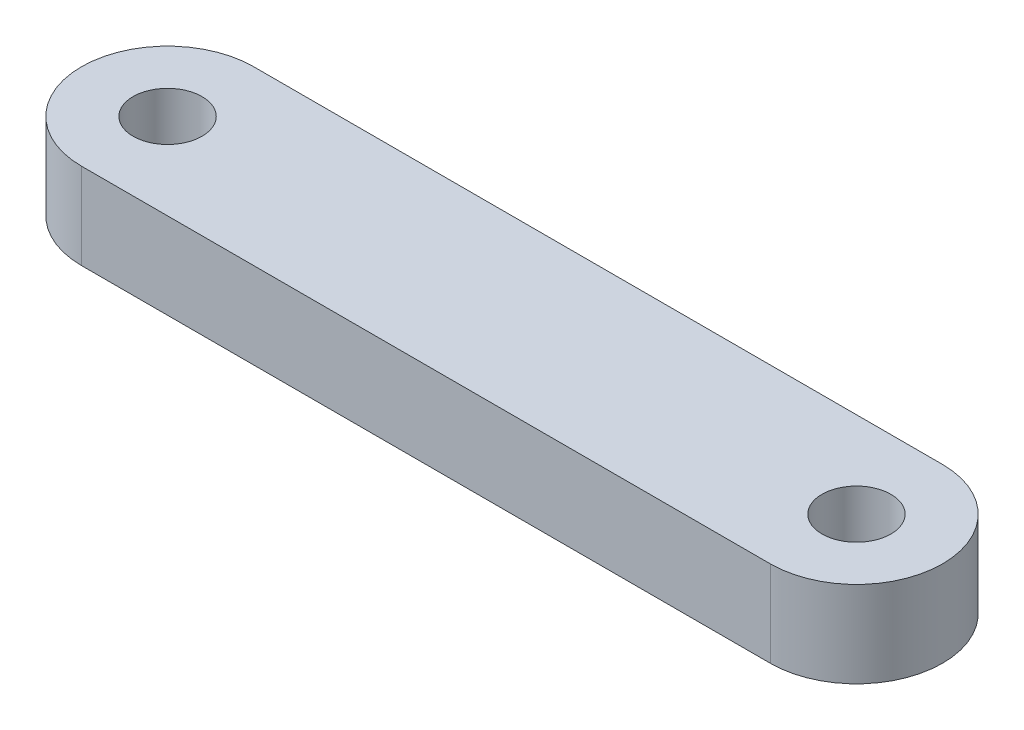
ISO-10303-21;
HEADER;
FILE_DESCRIPTION(('STEP AP214'),'2;1');
FILE_NAME('part.step','',(''),(''),'','','');
FILE_SCHEMA(('AUTOMOTIVE_DESIGN { 1 0 10303 214 1 1 1 1 }'));
ENDSEC;
DATA;
#1=APPLICATION_CONTEXT('core data for automotive mechanical design processes');
#2=APPLICATION_PROTOCOL_DEFINITION('international standard','automotive_design',2000,#1);
#3=PRODUCT_CONTEXT('',#1,'mechanical');
#4=PRODUCT('Part','Part','',(#3));
#5=PRODUCT_RELATED_PRODUCT_CATEGORY('part','',(#4));
#6=PRODUCT_DEFINITION_FORMATION('','',#4);
#7=PRODUCT_DEFINITION_CONTEXT('part definition',#1,'design');
#8=PRODUCT_DEFINITION('design','',#6,#7);
#9=PRODUCT_DEFINITION_SHAPE('','',#8);
#10=(LENGTH_UNIT() NAMED_UNIT(*) SI_UNIT(.MILLI.,.METRE.));
#11=(NAMED_UNIT(*) PLANE_ANGLE_UNIT() SI_UNIT($,.RADIAN.));
#12=(NAMED_UNIT(*) SI_UNIT($,.STERADIAN.) SOLID_ANGLE_UNIT());
#13=UNCERTAINTY_MEASURE_WITH_UNIT(LENGTH_MEASURE(1.E-05),#10,'distance_accuracy_value','');
#14=(GEOMETRIC_REPRESENTATION_CONTEXT(3) GLOBAL_UNCERTAINTY_ASSIGNED_CONTEXT((#13)) GLOBAL_UNIT_ASSIGNED_CONTEXT((#10,
#11,#12)) REPRESENTATION_CONTEXT('',''));
#15=CARTESIAN_POINT('',(0.,0.,0.));
#16=DIRECTION('',(0.,0.,1.));
#17=DIRECTION('',(1.,0.,0.));
#18=AXIS2_PLACEMENT_3D('',#15,#16,#17);
#19=CARTESIAN_POINT('',(-58.5992733205223,50.,0.));
#20=DIRECTION('',(0.,-1.,0.));
#21=DIRECTION('',(0.,0.,-1.));
#22=AXIS2_PLACEMENT_3D('',#19,#20,#21);
#23=CYLINDRICAL_SURFACE('',#22,50.);
#24=CARTESIAN_POINT('',(-58.5992733205223,0.,0.));
#25=DIRECTION('',(0.,1.,0.));
#26=DIRECTION('',(0.,0.,1.));
#27=AXIS2_PLACEMENT_3D('',#24,#25,#26);
#28=CIRCLE('',#27,50.);
#29=CARTESIAN_POINT('',(-58.5992733205223,0.,-50.));
#30=VERTEX_POINT('',#29);
#31=CARTESIAN_POINT('',(-58.5992733205223,0.,50.));
#32=VERTEX_POINT('',#31);
#33=EDGE_CURVE('E96',#30,#32,#28,.T.);
#34=ORIENTED_EDGE('',*,*,#33,.T.);
#35=DIRECTION('',(0.,-1.,0.));
#36=VECTOR('',#35,1.);
#37=CARTESIAN_POINT('',(-58.5992733205223,50.,50.));
#38=LINE('',#37,#36);
#39=CARTESIAN_POINT('',(-58.5992733205223,50.,50.));
#40=VERTEX_POINT('',#39);
#41=EDGE_CURVE('E11',#40,#32,#38,.T.);
#42=ORIENTED_EDGE('',*,*,#41,.F.);
#43=CARTESIAN_POINT('',(-58.5992733205223,50.,0.));
#44=DIRECTION('',(0.,1.,0.));
#45=DIRECTION('',(0.,0.,1.));
#46=AXIS2_PLACEMENT_3D('',#43,#44,#45);
#47=CIRCLE('',#46,50.);
#48=CARTESIAN_POINT('',(-58.5992733205223,50.,-50.));
#49=VERTEX_POINT('',#48);
#50=EDGE_CURVE('E84',#49,#40,#47,.T.);
#51=ORIENTED_EDGE('',*,*,#50,.F.);
#52=DIRECTION('',(0.,-1.,0.));
#53=VECTOR('',#52,1.);
#54=CARTESIAN_POINT('',(-58.5992733205223,50.,-50.));
#55=LINE('',#54,#53);
#56=EDGE_CURVE('E92',#49,#30,#55,.T.);
#57=ORIENTED_EDGE('',*,*,#56,.T.);
#58=EDGE_LOOP('',(#34,#42,#51,#57));
#59=FACE_BOUND('',#58,.T.);
#60=ADVANCED_FACE('F33',(#59),#23,.T.);
#61=CARTESIAN_POINT('',(-58.5992733205223,50.,50.));
#62=DIRECTION('',(0.,0.,-1.));
#63=DIRECTION('',(-1.,0.,0.));
#64=AXIS2_PLACEMENT_3D('',#61,#62,#63);
#65=PLANE('',#64);
#66=DIRECTION('',(1.,0.,0.));
#67=VECTOR('',#66,1.);
#68=CARTESIAN_POINT('',(-58.5992733205223,0.,50.));
#69=LINE('',#68,#67);
#70=CARTESIAN_POINT('',(341.400726679478,0.,50.));
#71=VERTEX_POINT('',#70);
#72=EDGE_CURVE('E88',#32,#71,#69,.T.);
#73=ORIENTED_EDGE('',*,*,#72,.T.);
#74=DIRECTION('',(0.,-1.,0.));
#75=VECTOR('',#74,1.);
#76=CARTESIAN_POINT('',(341.400726679478,50.,50.));
#77=LINE('',#76,#75);
#78=CARTESIAN_POINT('',(341.400726679478,50.,50.));
#79=VERTEX_POINT('',#78);
#80=EDGE_CURVE('E41',#79,#71,#77,.T.);
#81=ORIENTED_EDGE('',*,*,#80,.F.);
#82=DIRECTION('',(1.,0.,0.));
#83=VECTOR('',#82,1.);
#84=CARTESIAN_POINT('',(-58.5992733205223,50.,50.));
#85=LINE('',#84,#83);
#86=EDGE_CURVE('E79',#40,#79,#85,.T.);
#87=ORIENTED_EDGE('',*,*,#86,.F.);
#88=ORIENTED_EDGE('',*,*,#41,.T.);
#89=EDGE_LOOP('',(#73,#81,#87,#88));
#90=FACE_BOUND('',#89,.T.);
#91=ADVANCED_FACE('F87',(#90),#65,.F.);
#92=CARTESIAN_POINT('',(341.400726679478,50.,0.));
#93=DIRECTION('',(0.,-1.,0.));
#94=DIRECTION('',(0.,0.,-1.));
#95=AXIS2_PLACEMENT_3D('',#92,#93,#94);
#96=CYLINDRICAL_SURFACE('',#95,50.);
#97=CARTESIAN_POINT('',(341.400726679478,0.,0.));
#98=DIRECTION('',(0.,1.,0.));
#99=DIRECTION('',(0.,0.,1.));
#100=AXIS2_PLACEMENT_3D('',#97,#98,#99);
#101=CIRCLE('',#100,50.);
#102=CARTESIAN_POINT('',(341.400726679478,0.,-50.));
#103=VERTEX_POINT('',#102);
#104=EDGE_CURVE('E66',#71,#103,#101,.T.);
#105=ORIENTED_EDGE('',*,*,#104,.T.);
#106=DIRECTION('',(0.,-1.,0.));
#107=VECTOR('',#106,1.);
#108=CARTESIAN_POINT('',(341.400726679478,50.,-50.));
#109=LINE('',#108,#107);
#110=CARTESIAN_POINT('',(341.400726679478,50.,-50.));
#111=VERTEX_POINT('',#110);
#112=EDGE_CURVE('E89',#111,#103,#109,.T.);
#113=ORIENTED_EDGE('',*,*,#112,.F.);
#114=CARTESIAN_POINT('',(341.400726679478,50.,0.));
#115=DIRECTION('',(0.,1.,0.));
#116=DIRECTION('',(0.,0.,1.));
#117=AXIS2_PLACEMENT_3D('',#114,#115,#116);
#118=CIRCLE('',#117,50.);
#119=EDGE_CURVE('E82',#79,#111,#118,.T.);
#120=ORIENTED_EDGE('',*,*,#119,.F.);
#121=ORIENTED_EDGE('',*,*,#80,.T.);
#122=EDGE_LOOP('',(#105,#113,#120,#121));
#123=FACE_BOUND('',#122,.T.);
#124=ADVANCED_FACE('F90',(#123),#96,.T.);
#125=CARTESIAN_POINT('',(-58.5992733205223,50.,-50.));
#126=DIRECTION('',(0.,0.,1.));
#127=DIRECTION('',(1.,0.,0.));
#128=AXIS2_PLACEMENT_3D('',#125,#126,#127);
#129=PLANE('',#128);
#130=DIRECTION('',(-1.,0.,0.));
#131=VECTOR('',#130,1.);
#132=CARTESIAN_POINT('',(-58.5992733205223,0.,-50.));
#133=LINE('',#132,#131);
#134=EDGE_CURVE('E72',#103,#30,#133,.T.);
#135=ORIENTED_EDGE('',*,*,#134,.T.);
#136=ORIENTED_EDGE('',*,*,#56,.F.);
#137=DIRECTION('',(-1.,0.,0.));
#138=VECTOR('',#137,1.);
#139=CARTESIAN_POINT('',(-58.5992733205223,50.,-50.));
#140=LINE('',#139,#138);
#141=EDGE_CURVE('E49',#111,#49,#140,.T.);
#142=ORIENTED_EDGE('',*,*,#141,.F.);
#143=ORIENTED_EDGE('',*,*,#112,.T.);
#144=EDGE_LOOP('',(#135,#136,#142,#143));
#145=FACE_BOUND('',#144,.T.);
#146=ADVANCED_FACE('F104',(#145),#129,.F.);
#147=CARTESIAN_POINT('',(-58.5992733205223,50.,0.));
#148=DIRECTION('',(0.,1.,0.));
#149=DIRECTION('',(0.,0.,1.));
#150=AXIS2_PLACEMENT_3D('',#147,#148,#149);
#151=PLANE('',#150);
#152=CARTESIAN_POINT('',(341.400726679478,50.,0.));
#153=DIRECTION('',(0.,1.,0.));
#154=DIRECTION('',(0.,0.,1.));
#155=AXIS2_PLACEMENT_3D('',#152,#153,#154);
#156=CIRCLE('',#155,20.);
#157=CARTESIAN_POINT('',(341.400726679478,50.,20.));
#158=VERTEX_POINT('',#157);
#159=EDGE_CURVE('E116',#158,#158,#156,.T.);
#160=ORIENTED_EDGE('',*,*,#159,.F.);
#161=EDGE_LOOP('',(#160));
#162=FACE_BOUND('',#161,.T.);
#163=CARTESIAN_POINT('',(-58.5992733205223,50.,0.));
#164=DIRECTION('',(0.,1.,0.));
#165=DIRECTION('',(0.,0.,1.));
#166=AXIS2_PLACEMENT_3D('',#163,#164,#165);
#167=CIRCLE('',#166,20.);
#168=CARTESIAN_POINT('',(-58.5992733205223,50.,20.));
#169=VERTEX_POINT('',#168);
#170=EDGE_CURVE('E110',#169,#169,#167,.T.);
#171=ORIENTED_EDGE('',*,*,#170,.F.);
#172=EDGE_LOOP('',(#171));
#173=FACE_BOUND('',#172,.T.);
#174=ORIENTED_EDGE('',*,*,#50,.T.);
#175=ORIENTED_EDGE('',*,*,#86,.T.);
#176=ORIENTED_EDGE('',*,*,#119,.T.);
#177=ORIENTED_EDGE('',*,*,#141,.T.);
#178=EDGE_LOOP('',(#174,#175,#176,#177));
#179=FACE_BOUND('',#178,.T.);
#180=ADVANCED_FACE('F80',(#162,#173,#179),#151,.T.);
#181=CARTESIAN_POINT('',(-58.5992733205223,0.,0.));
#182=DIRECTION('',(0.,1.,0.));
#183=DIRECTION('',(0.,0.,1.));
#184=AXIS2_PLACEMENT_3D('',#181,#182,#183);
#185=PLANE('',#184);
#186=CARTESIAN_POINT('',(341.400726679478,0.,0.));
#187=DIRECTION('',(0.,1.,0.));
#188=DIRECTION('',(0.,0.,1.));
#189=AXIS2_PLACEMENT_3D('',#186,#187,#188);
#190=CIRCLE('',#189,20.);
#191=CARTESIAN_POINT('',(341.400726679478,0.,20.));
#192=VERTEX_POINT('',#191);
#193=EDGE_CURVE('E113',#192,#192,#190,.T.);
#194=ORIENTED_EDGE('',*,*,#193,.T.);
#195=EDGE_LOOP('',(#194));
#196=FACE_BOUND('',#195,.T.);
#197=CARTESIAN_POINT('',(-58.5992733205223,0.,0.));
#198=DIRECTION('',(0.,1.,0.));
#199=DIRECTION('',(0.,0.,1.));
#200=AXIS2_PLACEMENT_3D('',#197,#198,#199);
#201=CIRCLE('',#200,20.);
#202=CARTESIAN_POINT('',(-58.5992733205223,0.,20.));
#203=VERTEX_POINT('',#202);
#204=EDGE_CURVE('E99',#203,#203,#201,.T.);
#205=ORIENTED_EDGE('',*,*,#204,.T.);
#206=EDGE_LOOP('',(#205));
#207=FACE_BOUND('',#206,.T.);
#208=ORIENTED_EDGE('',*,*,#33,.F.);
#209=ORIENTED_EDGE('',*,*,#134,.F.);
#210=ORIENTED_EDGE('',*,*,#104,.F.);
#211=ORIENTED_EDGE('',*,*,#72,.F.);
#212=EDGE_LOOP('',(#208,#209,#210,#211));
#213=FACE_BOUND('',#212,.T.);
#214=ADVANCED_FACE('F107',(#196,#207,#213),#185,.F.);
#215=CARTESIAN_POINT('',(-58.5992733205223,0.,0.));
#216=DIRECTION('',(0.,1.,0.));
#217=DIRECTION('',(0.,0.,1.));
#218=AXIS2_PLACEMENT_3D('',#215,#216,#217);
#219=CYLINDRICAL_SURFACE('',#218,20.);
#220=ORIENTED_EDGE('',*,*,#204,.F.);
#221=EDGE_LOOP('',(#220));
#222=FACE_BOUND('',#221,.T.);
#223=ORIENTED_EDGE('',*,*,#170,.T.);
#224=EDGE_LOOP('',(#223));
#225=FACE_BOUND('',#224,.T.);
#226=ADVANCED_FACE('F127',(#222,#225),#219,.F.);
#227=CARTESIAN_POINT('',(341.400726679478,0.,0.));
#228=DIRECTION('',(0.,1.,0.));
#229=DIRECTION('',(0.,0.,1.));
#230=AXIS2_PLACEMENT_3D('',#227,#228,#229);
#231=CYLINDRICAL_SURFACE('',#230,20.);
#232=ORIENTED_EDGE('',*,*,#193,.F.);
#233=EDGE_LOOP('',(#232));
#234=FACE_BOUND('',#233,.T.);
#235=ORIENTED_EDGE('',*,*,#159,.T.);
#236=EDGE_LOOP('',(#235));
#237=FACE_BOUND('',#236,.T.);
#238=ADVANCED_FACE('F124',(#234,#237),#231,.F.);
#239=CLOSED_SHELL('',(#60,#91,#124,#146,#180,#214,#226,#238));
#240=MANIFOLD_SOLID_BREP('B2',#239);
#241=ADVANCED_BREP_SHAPE_REPRESENTATION('',(#18,#240),#14);
#242=SHAPE_DEFINITION_REPRESENTATION(#9,#241);
ENDSEC;
END-ISO-10303-21;
